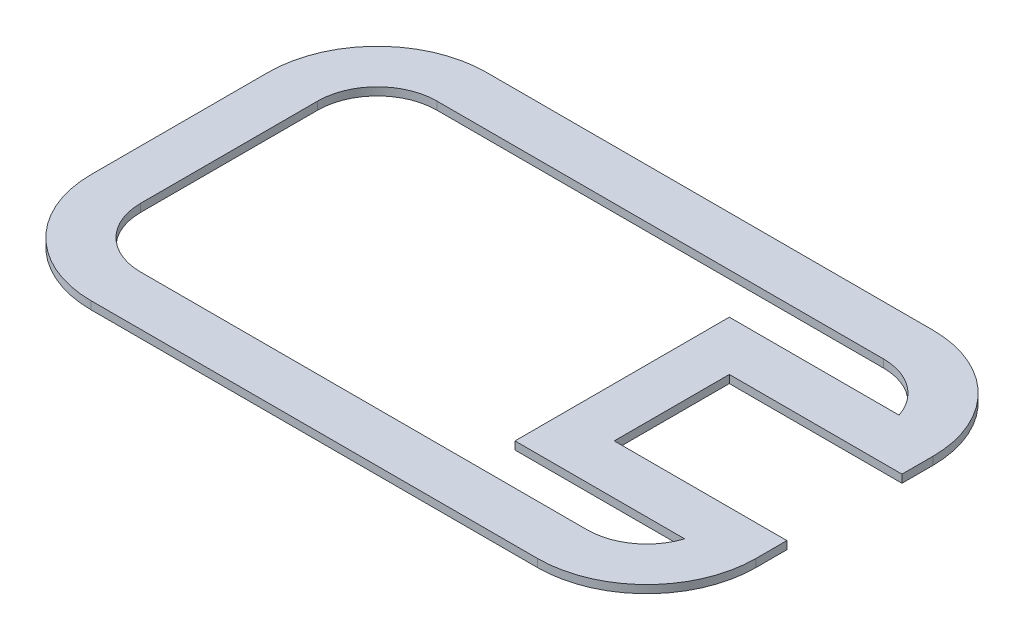
ISO-10303-21;
HEADER;
FILE_DESCRIPTION(('STEP AP214'),'2;1');
FILE_NAME('part.step','',(''),(''),'','','');
FILE_SCHEMA(('AUTOMOTIVE_DESIGN { 1 0 10303 214 1 1 1 1 }'));
ENDSEC;
DATA;
#1=APPLICATION_CONTEXT('core data for automotive mechanical design processes');
#2=APPLICATION_PROTOCOL_DEFINITION('international standard','automotive_design',2000,#1);
#3=PRODUCT_CONTEXT('',#1,'mechanical');
#4=PRODUCT('Part','Part','',(#3));
#5=PRODUCT_RELATED_PRODUCT_CATEGORY('part','',(#4));
#6=PRODUCT_DEFINITION_FORMATION('','',#4);
#7=PRODUCT_DEFINITION_CONTEXT('part definition',#1,'design');
#8=PRODUCT_DEFINITION('design','',#6,#7);
#9=PRODUCT_DEFINITION_SHAPE('','',#8);
#10=(LENGTH_UNIT() NAMED_UNIT(*) SI_UNIT(.MILLI.,.METRE.));
#11=(NAMED_UNIT(*) PLANE_ANGLE_UNIT() SI_UNIT($,.RADIAN.));
#12=(NAMED_UNIT(*) SI_UNIT($,.STERADIAN.) SOLID_ANGLE_UNIT());
#13=UNCERTAINTY_MEASURE_WITH_UNIT(LENGTH_MEASURE(1.E-05),#10,'distance_accuracy_value','');
#14=(GEOMETRIC_REPRESENTATION_CONTEXT(3) GLOBAL_UNCERTAINTY_ASSIGNED_CONTEXT((#13)) GLOBAL_UNIT_ASSIGNED_CONTEXT((#10,
#11,#12)) REPRESENTATION_CONTEXT('',''));
#15=CARTESIAN_POINT('',(0.,0.,0.));
#16=DIRECTION('',(0.,0.,1.));
#17=DIRECTION('',(1.,0.,0.));
#18=AXIS2_PLACEMENT_3D('',#15,#16,#17);
#19=CARTESIAN_POINT('',(-1.50147497416037,4.,115.909082592753));
#20=DIRECTION('',(0.,1.,0.));
#21=DIRECTION('',(0.,0.,1.));
#22=AXIS2_PLACEMENT_3D('',#19,#20,#21);
#23=PLANE('',#22);
#24=CARTESIAN_POINT('',(-1.50147497416037,4.,115.909082592753));
#25=DIRECTION('',(0.,1.,0.));
#26=DIRECTION('',(0.,0.,1.));
#27=AXIS2_PLACEMENT_3D('',#24,#25,#26);
#28=CIRCLE('',#27,55.);
#29=CARTESIAN_POINT('',(-56.5014749741604,4.,115.909082592752));
#30=VERTEX_POINT('',#29);
#31=CARTESIAN_POINT('',(-1.50147497415997,4.,170.909082592753));
#32=VERTEX_POINT('',#31);
#33=EDGE_CURVE('E261',#30,#32,#28,.T.);
#34=ORIENTED_EDGE('',*,*,#33,.T.);
#35=DIRECTION('',(1.,0.,0.));
#36=VECTOR('',#35,1.);
#37=CARTESIAN_POINT('',(-1.50147497415997,4.,170.909082592753));
#38=LINE('',#37,#36);
#39=CARTESIAN_POINT('',(223.528525025839,4.,170.909082592753));
#40=VERTEX_POINT('',#39);
#41=EDGE_CURVE('E264',#32,#40,#38,.T.);
#42=ORIENTED_EDGE('',*,*,#41,.T.);
#43=CARTESIAN_POINT('',(223.52852502584,4.,115.909082592753));
#44=DIRECTION('',(0.,1.,0.));
#45=DIRECTION('',(0.,0.,1.));
#46=AXIS2_PLACEMENT_3D('',#43,#44,#45);
#47=CIRCLE('',#46,55.);
#48=CARTESIAN_POINT('',(278.52852502584,4.,115.909082592752));
#49=VERTEX_POINT('',#48);
#50=EDGE_CURVE('E267',#40,#49,#47,.T.);
#51=ORIENTED_EDGE('',*,*,#50,.T.);
#52=DIRECTION('',(0.,0.,-1.));
#53=VECTOR('',#52,1.);
#54=CARTESIAN_POINT('',(278.52852502584,4.,100.279082592753));
#55=LINE('',#54,#53);
#56=CARTESIAN_POINT('',(278.52852502584,4.,100.279082592753));
#57=VERTEX_POINT('',#56);
#58=EDGE_CURVE('E269',#49,#57,#55,.T.);
#59=ORIENTED_EDGE('',*,*,#58,.T.);
#60=DIRECTION('',(-1.,0.,0.));
#61=VECTOR('',#60,1.);
#62=CARTESIAN_POINT('',(191.52852502584,4.,100.279082592753));
#63=LINE('',#62,#61);
#64=CARTESIAN_POINT('',(191.52852502584,4.,100.279082592753));
#65=VERTEX_POINT('',#64);
#66=EDGE_CURVE('E271',#57,#65,#63,.T.);
#67=ORIENTED_EDGE('',*,*,#66,.T.);
#68=DIRECTION('',(0.,0.,-1.));
#69=VECTOR('',#68,1.);
#70=CARTESIAN_POINT('',(191.52852502584,4.,42.2790825927528));
#71=LINE('',#70,#69);
#72=CARTESIAN_POINT('',(191.52852502584,4.,42.2790825927528));
#73=VERTEX_POINT('',#72);
#74=EDGE_CURVE('E273',#65,#73,#71,.T.);
#75=ORIENTED_EDGE('',*,*,#74,.T.);
#76=DIRECTION('',(1.,0.,0.));
#77=VECTOR('',#76,1.);
#78=CARTESIAN_POINT('',(191.52852502584,4.,42.2790825927528));
#79=LINE('',#78,#77);
#80=CARTESIAN_POINT('',(278.52852502584,4.,42.2790825927528));
#81=VERTEX_POINT('',#80);
#82=EDGE_CURVE('E275',#73,#81,#79,.T.);
#83=ORIENTED_EDGE('',*,*,#82,.T.);
#84=DIRECTION('',(0.,0.,-1.));
#85=VECTOR('',#84,1.);
#86=CARTESIAN_POINT('',(278.52852502584,4.,26.6490825927532));
#87=LINE('',#86,#85);
#88=CARTESIAN_POINT('',(278.52852502584,4.,26.6490825927532));
#89=VERTEX_POINT('',#88);
#90=EDGE_CURVE('E277',#81,#89,#87,.T.);
#91=ORIENTED_EDGE('',*,*,#90,.T.);
#92=CARTESIAN_POINT('',(223.52852502584,4.,26.6490825927529));
#93=DIRECTION('',(0.,1.,0.));
#94=DIRECTION('',(0.,0.,-1.));
#95=AXIS2_PLACEMENT_3D('',#92,#93,#94);
#96=CIRCLE('',#95,55.);
#97=CARTESIAN_POINT('',(223.528525025839,4.,-28.3509174072471));
#98=VERTEX_POINT('',#97);
#99=EDGE_CURVE('E279',#89,#98,#96,.T.);
#100=ORIENTED_EDGE('',*,*,#99,.T.);
#101=DIRECTION('',(-1.,0.,0.));
#102=VECTOR('',#101,1.);
#103=CARTESIAN_POINT('',(-1.50147497416,4.,-28.3509174072471));
#104=LINE('',#103,#102);
#105=CARTESIAN_POINT('',(-1.50147497416001,4.,-28.3509174072471));
#106=VERTEX_POINT('',#105);
#107=EDGE_CURVE('E281',#98,#106,#104,.T.);
#108=ORIENTED_EDGE('',*,*,#107,.T.);
#109=CARTESIAN_POINT('',(-1.50147497416038,4.,26.6490825927529));
#110=DIRECTION('',(0.,1.,0.));
#111=DIRECTION('',(0.,0.,1.));
#112=AXIS2_PLACEMENT_3D('',#109,#110,#111);
#113=CIRCLE('',#112,55.);
#114=CARTESIAN_POINT('',(-56.5014749741604,4.,26.6490825927532));
#115=VERTEX_POINT('',#114);
#116=EDGE_CURVE('E283',#106,#115,#113,.T.);
#117=ORIENTED_EDGE('',*,*,#116,.T.);
#118=DIRECTION('',(0.,0.,1.));
#119=VECTOR('',#118,1.);
#120=CARTESIAN_POINT('',(-56.5014749741604,4.,26.6490825927532));
#121=LINE('',#120,#119);
#122=EDGE_CURVE('E285',#115,#30,#121,.T.);
#123=ORIENTED_EDGE('',*,*,#122,.T.);
#124=EDGE_LOOP('',(#34,#42,#51,#59,#67,#75,#83,#91,#100,#108,#117,#123));
#125=FACE_BOUND('',#124,.T.);
#126=DIRECTION('',(0.,0.,-1.));
#127=VECTOR('',#126,1.);
#128=CARTESIAN_POINT('',(166.52852502584,4.,17.2790825927528));
#129=LINE('',#128,#127);
#130=CARTESIAN_POINT('',(166.52852502584,4.,125.279082592753));
#131=VERTEX_POINT('',#130);
#132=CARTESIAN_POINT('',(166.52852502584,4.,17.2790825927528));
#133=VERTEX_POINT('',#132);
#134=EDGE_CURVE('E190',#131,#133,#129,.T.);
#135=ORIENTED_EDGE('',*,*,#134,.F.);
#136=DIRECTION('',(-1.,0.,0.));
#137=VECTOR('',#136,1.);
#138=CARTESIAN_POINT('',(166.52852502584,4.,125.279082592753));
#139=LINE('',#138,#137);
#140=CARTESIAN_POINT('',(252.027702206944,4.,125.279082592753));
#141=VERTEX_POINT('',#140);
#142=EDGE_CURVE('E182',#141,#131,#139,.T.);
#143=ORIENTED_EDGE('',*,*,#142,.F.);
#144=CARTESIAN_POINT('',(223.52852502584,4.,115.909082592753));
#145=DIRECTION('',(0.,1.,0.));
#146=DIRECTION('',(0.,0.,1.));
#147=AXIS2_PLACEMENT_3D('',#144,#145,#146);
#148=CIRCLE('',#147,30.);
#149=CARTESIAN_POINT('',(223.52852502584,4.,145.909082592753));
#150=VERTEX_POINT('',#149);
#151=EDGE_CURVE('E219',#150,#141,#148,.T.);
#152=ORIENTED_EDGE('',*,*,#151,.F.);
#153=DIRECTION('',(1.,0.,0.));
#154=VECTOR('',#153,1.);
#155=CARTESIAN_POINT('',(-1.50147497415997,4.,145.909082592753));
#156=LINE('',#155,#154);
#157=CARTESIAN_POINT('',(-1.50147497415997,4.,145.909082592753));
#158=VERTEX_POINT('',#157);
#159=EDGE_CURVE('E217',#158,#150,#156,.T.);
#160=ORIENTED_EDGE('',*,*,#159,.F.);
#161=CARTESIAN_POINT('',(-1.50147497416037,4.,115.909082592753));
#162=DIRECTION('',(0.,1.,0.));
#163=DIRECTION('',(0.,0.,1.));
#164=AXIS2_PLACEMENT_3D('',#161,#162,#163);
#165=CIRCLE('',#164,30.);
#166=CARTESIAN_POINT('',(-31.5014749741604,4.,115.909082592753));
#167=VERTEX_POINT('',#166);
#168=EDGE_CURVE('E215',#167,#158,#165,.T.);
#169=ORIENTED_EDGE('',*,*,#168,.F.);
#170=DIRECTION('',(0.,0.,1.));
#171=VECTOR('',#170,1.);
#172=CARTESIAN_POINT('',(-31.5014749741604,4.,26.6490825927532));
#173=LINE('',#172,#171);
#174=CARTESIAN_POINT('',(-31.5014749741604,4.,26.6490825927532));
#175=VERTEX_POINT('',#174);
#176=EDGE_CURVE('E213',#175,#167,#173,.T.);
#177=ORIENTED_EDGE('',*,*,#176,.F.);
#178=CARTESIAN_POINT('',(-1.50147497416038,4.,26.6490825927529));
#179=DIRECTION('',(0.,1.,0.));
#180=DIRECTION('',(0.,0.,1.));
#181=AXIS2_PLACEMENT_3D('',#178,#179,#180);
#182=CIRCLE('',#181,30.);
#183=CARTESIAN_POINT('',(-1.50147497416018,4.,-3.35091740724714));
#184=VERTEX_POINT('',#183);
#185=EDGE_CURVE('E211',#184,#175,#182,.T.);
#186=ORIENTED_EDGE('',*,*,#185,.F.);
#187=DIRECTION('',(-1.,0.,0.));
#188=VECTOR('',#187,1.);
#189=CARTESIAN_POINT('',(-1.50147497416017,4.,-3.35091740724714));
#190=LINE('',#189,#188);
#191=CARTESIAN_POINT('',(223.528525025839,4.,-3.35091740724714));
#192=VERTEX_POINT('',#191);
#193=EDGE_CURVE('E209',#192,#184,#190,.T.);
#194=ORIENTED_EDGE('',*,*,#193,.F.);
#195=CARTESIAN_POINT('',(223.52852502584,4.,26.6490825927529));
#196=DIRECTION('',(0.,1.,0.));
#197=DIRECTION('',(0.,0.,-1.));
#198=AXIS2_PLACEMENT_3D('',#195,#196,#197);
#199=CIRCLE('',#198,30.);
#200=CARTESIAN_POINT('',(252.027702206944,4.,17.2790825927528));
#201=VERTEX_POINT('',#200);
#202=EDGE_CURVE('E205',#201,#192,#199,.T.);
#203=ORIENTED_EDGE('',*,*,#202,.F.);
#204=DIRECTION('',(1.,0.,0.));
#205=VECTOR('',#204,1.);
#206=CARTESIAN_POINT('',(166.52852502584,4.,17.2790825927528));
#207=LINE('',#206,#205);
#208=EDGE_CURVE('E203',#133,#201,#207,.T.);
#209=ORIENTED_EDGE('',*,*,#208,.F.);
#210=EDGE_LOOP('',(#135,#143,#152,#160,#169,#177,#186,#194,#203,#209));
#211=FACE_BOUND('',#210,.T.);
#212=ADVANCED_FACE('F33',(#125,#211),#23,.T.);
#213=CARTESIAN_POINT('',(-1.50147497416037,0.,115.909082592753));
#214=DIRECTION('',(0.,1.,0.));
#215=DIRECTION('',(0.,0.,1.));
#216=AXIS2_PLACEMENT_3D('',#213,#214,#215);
#217=PLANE('',#216);
#218=CARTESIAN_POINT('',(-1.50147497416037,0.,115.909082592753));
#219=DIRECTION('',(0.,1.,0.));
#220=DIRECTION('',(0.,0.,1.));
#221=AXIS2_PLACEMENT_3D('',#218,#219,#220);
#222=CIRCLE('',#221,55.);
#223=CARTESIAN_POINT('',(-56.5014749741604,0.,115.909082592752));
#224=VERTEX_POINT('',#223);
#225=CARTESIAN_POINT('',(-1.50147497415997,0.,170.909082592753));
#226=VERTEX_POINT('',#225);
#227=EDGE_CURVE('E198',#224,#226,#222,.T.);
#228=ORIENTED_EDGE('',*,*,#227,.F.);
#229=DIRECTION('',(0.,0.,1.));
#230=VECTOR('',#229,1.);
#231=CARTESIAN_POINT('',(-56.5014749741604,0.,26.6490825927532));
#232=LINE('',#231,#230);
#233=CARTESIAN_POINT('',(-56.5014749741604,0.,26.6490825927532));
#234=VERTEX_POINT('',#233);
#235=EDGE_CURVE('E265',#234,#224,#232,.T.);
#236=ORIENTED_EDGE('',*,*,#235,.F.);
#237=CARTESIAN_POINT('',(-1.50147497416038,0.,26.6490825927529));
#238=DIRECTION('',(0.,1.,0.));
#239=DIRECTION('',(0.,0.,1.));
#240=AXIS2_PLACEMENT_3D('',#237,#238,#239);
#241=CIRCLE('',#240,55.);
#242=CARTESIAN_POINT('',(-1.50147497416001,0.,-28.3509174072471));
#243=VERTEX_POINT('',#242);
#244=EDGE_CURVE('E308',#243,#234,#241,.T.);
#245=ORIENTED_EDGE('',*,*,#244,.F.);
#246=DIRECTION('',(-1.,0.,0.));
#247=VECTOR('',#246,1.);
#248=CARTESIAN_POINT('',(-1.50147497416,0.,-28.3509174072471));
#249=LINE('',#248,#247);
#250=CARTESIAN_POINT('',(223.528525025839,0.,-28.3509174072471));
#251=VERTEX_POINT('',#250);
#252=EDGE_CURVE('E306',#251,#243,#249,.T.);
#253=ORIENTED_EDGE('',*,*,#252,.F.);
#254=CARTESIAN_POINT('',(223.52852502584,0.,26.6490825927529));
#255=DIRECTION('',(0.,1.,0.));
#256=DIRECTION('',(0.,0.,-1.));
#257=AXIS2_PLACEMENT_3D('',#254,#255,#256);
#258=CIRCLE('',#257,55.);
#259=CARTESIAN_POINT('',(278.52852502584,0.,26.6490825927532));
#260=VERTEX_POINT('',#259);
#261=EDGE_CURVE('E304',#260,#251,#258,.T.);
#262=ORIENTED_EDGE('',*,*,#261,.F.);
#263=DIRECTION('',(0.,0.,-1.));
#264=VECTOR('',#263,1.);
#265=CARTESIAN_POINT('',(278.52852502584,0.,26.6490825927532));
#266=LINE('',#265,#264);
#267=CARTESIAN_POINT('',(278.52852502584,0.,42.2790825927528));
#268=VERTEX_POINT('',#267);
#269=EDGE_CURVE('E302',#268,#260,#266,.T.);
#270=ORIENTED_EDGE('',*,*,#269,.F.);
#271=DIRECTION('',(1.,0.,0.));
#272=VECTOR('',#271,1.);
#273=CARTESIAN_POINT('',(191.52852502584,0.,42.2790825927528));
#274=LINE('',#273,#272);
#275=CARTESIAN_POINT('',(191.52852502584,0.,42.2790825927528));
#276=VERTEX_POINT('',#275);
#277=EDGE_CURVE('E300',#276,#268,#274,.T.);
#278=ORIENTED_EDGE('',*,*,#277,.F.);
#279=DIRECTION('',(0.,0.,-1.));
#280=VECTOR('',#279,1.);
#281=CARTESIAN_POINT('',(191.52852502584,0.,42.2790825927528));
#282=LINE('',#281,#280);
#283=CARTESIAN_POINT('',(191.52852502584,0.,100.279082592753));
#284=VERTEX_POINT('',#283);
#285=EDGE_CURVE('E298',#284,#276,#282,.T.);
#286=ORIENTED_EDGE('',*,*,#285,.F.);
#287=DIRECTION('',(-1.,0.,0.));
#288=VECTOR('',#287,1.);
#289=CARTESIAN_POINT('',(191.52852502584,0.,100.279082592753));
#290=LINE('',#289,#288);
#291=CARTESIAN_POINT('',(278.52852502584,0.,100.279082592753));
#292=VERTEX_POINT('',#291);
#293=EDGE_CURVE('E296',#292,#284,#290,.T.);
#294=ORIENTED_EDGE('',*,*,#293,.F.);
#295=DIRECTION('',(0.,0.,-1.));
#296=VECTOR('',#295,1.);
#297=CARTESIAN_POINT('',(278.52852502584,0.,100.279082592753));
#298=LINE('',#297,#296);
#299=CARTESIAN_POINT('',(278.52852502584,0.,115.909082592752));
#300=VERTEX_POINT('',#299);
#301=EDGE_CURVE('E294',#300,#292,#298,.T.);
#302=ORIENTED_EDGE('',*,*,#301,.F.);
#303=CARTESIAN_POINT('',(223.52852502584,0.,115.909082592753));
#304=DIRECTION('',(0.,1.,0.));
#305=DIRECTION('',(0.,0.,1.));
#306=AXIS2_PLACEMENT_3D('',#303,#304,#305);
#307=CIRCLE('',#306,55.);
#308=CARTESIAN_POINT('',(223.528525025839,0.,170.909082592753));
#309=VERTEX_POINT('',#308);
#310=EDGE_CURVE('E292',#309,#300,#307,.T.);
#311=ORIENTED_EDGE('',*,*,#310,.F.);
#312=DIRECTION('',(1.,0.,0.));
#313=VECTOR('',#312,1.);
#314=CARTESIAN_POINT('',(-1.50147497415997,0.,170.909082592753));
#315=LINE('',#314,#313);
#316=EDGE_CURVE('E290',#226,#309,#315,.T.);
#317=ORIENTED_EDGE('',*,*,#316,.F.);
#318=EDGE_LOOP('',(#228,#236,#245,#253,#262,#270,#278,#286,#294,#302,#311,#317));
#319=FACE_BOUND('',#318,.T.);
#320=DIRECTION('',(-1.,0.,0.));
#321=VECTOR('',#320,1.);
#322=CARTESIAN_POINT('',(166.52852502584,0.,125.279082592753));
#323=LINE('',#322,#321);
#324=CARTESIAN_POINT('',(252.027702206944,0.,125.279082592753));
#325=VERTEX_POINT('',#324);
#326=CARTESIAN_POINT('',(166.52852502584,0.,125.279082592753));
#327=VERTEX_POINT('',#326);
#328=EDGE_CURVE('E56',#325,#327,#323,.T.);
#329=ORIENTED_EDGE('',*,*,#328,.T.);
#330=DIRECTION('',(0.,0.,-1.));
#331=VECTOR('',#330,1.);
#332=CARTESIAN_POINT('',(166.52852502584,0.,17.2790825927528));
#333=LINE('',#332,#331);
#334=CARTESIAN_POINT('',(166.52852502584,0.,17.2790825927528));
#335=VERTEX_POINT('',#334);
#336=EDGE_CURVE('E197',#327,#335,#333,.T.);
#337=ORIENTED_EDGE('',*,*,#336,.T.);
#338=DIRECTION('',(1.,0.,0.));
#339=VECTOR('',#338,1.);
#340=CARTESIAN_POINT('',(166.52852502584,0.,17.2790825927528));
#341=LINE('',#340,#339);
#342=CARTESIAN_POINT('',(252.027702206944,0.,17.2790825927528));
#343=VERTEX_POINT('',#342);
#344=EDGE_CURVE('E223',#335,#343,#341,.T.);
#345=ORIENTED_EDGE('',*,*,#344,.T.);
#346=CARTESIAN_POINT('',(223.52852502584,0.,26.6490825927529));
#347=DIRECTION('',(0.,1.,0.));
#348=DIRECTION('',(0.,0.,-1.));
#349=AXIS2_PLACEMENT_3D('',#346,#347,#348);
#350=CIRCLE('',#349,30.);
#351=CARTESIAN_POINT('',(223.528525025839,0.,-3.35091740724714));
#352=VERTEX_POINT('',#351);
#353=EDGE_CURVE('E226',#343,#352,#350,.T.);
#354=ORIENTED_EDGE('',*,*,#353,.T.);
#355=DIRECTION('',(-1.,0.,0.));
#356=VECTOR('',#355,1.);
#357=CARTESIAN_POINT('',(-1.50147497416017,0.,-3.35091740724714));
#358=LINE('',#357,#356);
#359=CARTESIAN_POINT('',(-1.50147497416018,0.,-3.35091740724714));
#360=VERTEX_POINT('',#359);
#361=EDGE_CURVE('E229',#352,#360,#358,.T.);
#362=ORIENTED_EDGE('',*,*,#361,.T.);
#363=CARTESIAN_POINT('',(-1.50147497416038,0.,26.6490825927529));
#364=DIRECTION('',(0.,1.,0.));
#365=DIRECTION('',(0.,0.,1.));
#366=AXIS2_PLACEMENT_3D('',#363,#364,#365);
#367=CIRCLE('',#366,30.);
#368=CARTESIAN_POINT('',(-31.5014749741604,0.,26.6490825927532));
#369=VERTEX_POINT('',#368);
#370=EDGE_CURVE('E232',#360,#369,#367,.T.);
#371=ORIENTED_EDGE('',*,*,#370,.T.);
#372=DIRECTION('',(0.,0.,1.));
#373=VECTOR('',#372,1.);
#374=CARTESIAN_POINT('',(-31.5014749741604,0.,26.6490825927532));
#375=LINE('',#374,#373);
#376=CARTESIAN_POINT('',(-31.5014749741604,0.,115.909082592753));
#377=VERTEX_POINT('',#376);
#378=EDGE_CURVE('E235',#369,#377,#375,.T.);
#379=ORIENTED_EDGE('',*,*,#378,.T.);
#380=CARTESIAN_POINT('',(-1.50147497416037,0.,115.909082592753));
#381=DIRECTION('',(0.,1.,0.));
#382=DIRECTION('',(0.,0.,1.));
#383=AXIS2_PLACEMENT_3D('',#380,#381,#382);
#384=CIRCLE('',#383,30.);
#385=CARTESIAN_POINT('',(-1.50147497415997,0.,145.909082592753));
#386=VERTEX_POINT('',#385);
#387=EDGE_CURVE('E238',#377,#386,#384,.T.);
#388=ORIENTED_EDGE('',*,*,#387,.T.);
#389=DIRECTION('',(1.,0.,0.));
#390=VECTOR('',#389,1.);
#391=CARTESIAN_POINT('',(-1.50147497415997,0.,145.909082592753));
#392=LINE('',#391,#390);
#393=CARTESIAN_POINT('',(223.528525025839,0.,145.909082592753));
#394=VERTEX_POINT('',#393);
#395=EDGE_CURVE('E241',#386,#394,#392,.T.);
#396=ORIENTED_EDGE('',*,*,#395,.T.);
#397=CARTESIAN_POINT('',(223.52852502584,0.,115.909082592753));
#398=DIRECTION('',(0.,1.,0.));
#399=DIRECTION('',(0.,0.,1.));
#400=AXIS2_PLACEMENT_3D('',#397,#398,#399);
#401=CIRCLE('',#400,30.);
#402=EDGE_CURVE('E191',#394,#325,#401,.T.);
#403=ORIENTED_EDGE('',*,*,#402,.T.);
#404=EDGE_LOOP('',(#329,#337,#345,#354,#362,#371,#379,#388,#396,#403));
#405=FACE_BOUND('',#404,.T.);
#406=ADVANCED_FACE('F350',(#319,#405),#217,.F.);
#407=CARTESIAN_POINT('',(-1.50147497416037,4.,115.909082592753));
#408=DIRECTION('',(0.,-1.,0.));
#409=DIRECTION('',(0.,0.,-1.));
#410=AXIS2_PLACEMENT_3D('',#407,#408,#409);
#411=CYLINDRICAL_SURFACE('',#410,55.);
#412=ORIENTED_EDGE('',*,*,#227,.T.);
#413=DIRECTION('',(0.,-1.,0.));
#414=VECTOR('',#413,1.);
#415=CARTESIAN_POINT('',(-1.50147497415997,4.,170.909082592753));
#416=LINE('',#415,#414);
#417=EDGE_CURVE('E11',#32,#226,#416,.T.);
#418=ORIENTED_EDGE('',*,*,#417,.F.);
#419=ORIENTED_EDGE('',*,*,#33,.F.);
#420=DIRECTION('',(0.,-1.,0.));
#421=VECTOR('',#420,1.);
#422=CARTESIAN_POINT('',(-56.5014749741604,4.,115.909082592752));
#423=LINE('',#422,#421);
#424=EDGE_CURVE('E287',#30,#224,#423,.T.);
#425=ORIENTED_EDGE('',*,*,#424,.T.);
#426=EDGE_LOOP('',(#412,#418,#419,#425));
#427=FACE_BOUND('',#426,.T.);
#428=ADVANCED_FACE('F35',(#427),#411,.T.);
#429=CARTESIAN_POINT('',(-1.50147497415997,4.,170.909082592753));
#430=DIRECTION('',(0.,0.,-1.));
#431=DIRECTION('',(-1.,0.,0.));
#432=AXIS2_PLACEMENT_3D('',#429,#430,#431);
#433=PLANE('',#432);
#434=ORIENTED_EDGE('',*,*,#316,.T.);
#435=DIRECTION('',(0.,-1.,0.));
#436=VECTOR('',#435,1.);
#437=CARTESIAN_POINT('',(223.528525025839,4.,170.909082592753));
#438=LINE('',#437,#436);
#439=EDGE_CURVE('E41',#40,#309,#438,.T.);
#440=ORIENTED_EDGE('',*,*,#439,.F.);
#441=ORIENTED_EDGE('',*,*,#41,.F.);
#442=ORIENTED_EDGE('',*,*,#417,.T.);
#443=EDGE_LOOP('',(#434,#440,#441,#442));
#444=FACE_BOUND('',#443,.T.);
#445=ADVANCED_FACE('F367',(#444),#433,.F.);
#446=CARTESIAN_POINT('',(223.52852502584,4.,115.909082592753));
#447=DIRECTION('',(0.,-1.,0.));
#448=DIRECTION('',(0.,0.,-1.));
#449=AXIS2_PLACEMENT_3D('',#446,#447,#448);
#450=CYLINDRICAL_SURFACE('',#449,55.);
#451=ORIENTED_EDGE('',*,*,#310,.T.);
#452=DIRECTION('',(0.,-1.,0.));
#453=VECTOR('',#452,1.);
#454=CARTESIAN_POINT('',(278.52852502584,4.,115.909082592752));
#455=LINE('',#454,#453);
#456=EDGE_CURVE('E337',#49,#300,#455,.T.);
#457=ORIENTED_EDGE('',*,*,#456,.F.);
#458=ORIENTED_EDGE('',*,*,#50,.F.);
#459=ORIENTED_EDGE('',*,*,#439,.T.);
#460=EDGE_LOOP('',(#451,#457,#458,#459));
#461=FACE_BOUND('',#460,.T.);
#462=ADVANCED_FACE('F344',(#461),#450,.T.);
#463=CARTESIAN_POINT('',(278.52852502584,4.,100.279082592753));
#464=DIRECTION('',(-1.,0.,0.));
#465=DIRECTION('',(0.,0.,1.));
#466=AXIS2_PLACEMENT_3D('',#463,#464,#465);
#467=PLANE('',#466);
#468=ORIENTED_EDGE('',*,*,#301,.T.);
#469=DIRECTION('',(0.,-1.,0.));
#470=VECTOR('',#469,1.);
#471=CARTESIAN_POINT('',(278.52852502584,4.,100.279082592753));
#472=LINE('',#471,#470);
#473=EDGE_CURVE('E334',#57,#292,#472,.T.);
#474=ORIENTED_EDGE('',*,*,#473,.F.);
#475=ORIENTED_EDGE('',*,*,#58,.F.);
#476=ORIENTED_EDGE('',*,*,#456,.T.);
#477=EDGE_LOOP('',(#468,#474,#475,#476));
#478=FACE_BOUND('',#477,.T.);
#479=ADVANCED_FACE('F356',(#478),#467,.F.);
#480=CARTESIAN_POINT('',(191.52852502584,4.,100.279082592753));
#481=DIRECTION('',(0.,0.,1.));
#482=DIRECTION('',(1.,0.,0.));
#483=AXIS2_PLACEMENT_3D('',#480,#481,#482);
#484=PLANE('',#483);
#485=ORIENTED_EDGE('',*,*,#293,.T.);
#486=DIRECTION('',(0.,-1.,0.));
#487=VECTOR('',#486,1.);
#488=CARTESIAN_POINT('',(191.52852502584,4.,100.279082592753));
#489=LINE('',#488,#487);
#490=EDGE_CURVE('E331',#65,#284,#489,.T.);
#491=ORIENTED_EDGE('',*,*,#490,.F.);
#492=ORIENTED_EDGE('',*,*,#66,.F.);
#493=ORIENTED_EDGE('',*,*,#473,.T.);
#494=EDGE_LOOP('',(#485,#491,#492,#493));
#495=FACE_BOUND('',#494,.T.);
#496=ADVANCED_FACE('F360',(#495),#484,.F.);
#497=CARTESIAN_POINT('',(191.52852502584,4.,42.2790825927528));
#498=DIRECTION('',(-1.,0.,0.));
#499=DIRECTION('',(0.,0.,1.));
#500=AXIS2_PLACEMENT_3D('',#497,#498,#499);
#501=PLANE('',#500);
#502=ORIENTED_EDGE('',*,*,#285,.T.);
#503=DIRECTION('',(0.,-1.,0.));
#504=VECTOR('',#503,1.);
#505=CARTESIAN_POINT('',(191.52852502584,4.,42.2790825927528));
#506=LINE('',#505,#504);
#507=EDGE_CURVE('E328',#73,#276,#506,.T.);
#508=ORIENTED_EDGE('',*,*,#507,.F.);
#509=ORIENTED_EDGE('',*,*,#74,.F.);
#510=ORIENTED_EDGE('',*,*,#490,.T.);
#511=EDGE_LOOP('',(#502,#508,#509,#510));
#512=FACE_BOUND('',#511,.T.);
#513=ADVANCED_FACE('F400',(#512),#501,.F.);
#514=CARTESIAN_POINT('',(191.52852502584,4.,42.2790825927528));
#515=DIRECTION('',(0.,0.,-1.));
#516=DIRECTION('',(-1.,0.,0.));
#517=AXIS2_PLACEMENT_3D('',#514,#515,#516);
#518=PLANE('',#517);
#519=ORIENTED_EDGE('',*,*,#277,.T.);
#520=DIRECTION('',(0.,-1.,0.));
#521=VECTOR('',#520,1.);
#522=CARTESIAN_POINT('',(278.52852502584,4.,42.2790825927528));
#523=LINE('',#522,#521);
#524=EDGE_CURVE('E325',#81,#268,#523,.T.);
#525=ORIENTED_EDGE('',*,*,#524,.F.);
#526=ORIENTED_EDGE('',*,*,#82,.F.);
#527=ORIENTED_EDGE('',*,*,#507,.T.);
#528=EDGE_LOOP('',(#519,#525,#526,#527));
#529=FACE_BOUND('',#528,.T.);
#530=ADVANCED_FACE('F398',(#529),#518,.F.);
#531=CARTESIAN_POINT('',(278.52852502584,4.,26.6490825927532));
#532=DIRECTION('',(-1.,0.,0.));
#533=DIRECTION('',(0.,0.,1.));
#534=AXIS2_PLACEMENT_3D('',#531,#532,#533);
#535=PLANE('',#534);
#536=ORIENTED_EDGE('',*,*,#269,.T.);
#537=DIRECTION('',(0.,-1.,0.));
#538=VECTOR('',#537,1.);
#539=CARTESIAN_POINT('',(278.52852502584,4.,26.6490825927532));
#540=LINE('',#539,#538);
#541=EDGE_CURVE('E322',#89,#260,#540,.T.);
#542=ORIENTED_EDGE('',*,*,#541,.F.);
#543=ORIENTED_EDGE('',*,*,#90,.F.);
#544=ORIENTED_EDGE('',*,*,#524,.T.);
#545=EDGE_LOOP('',(#536,#542,#543,#544));
#546=FACE_BOUND('',#545,.T.);
#547=ADVANCED_FACE('F394',(#546),#535,.F.);
#548=CARTESIAN_POINT('',(223.52852502584,4.,26.6490825927529));
#549=DIRECTION('',(0.,-1.,0.));
#550=DIRECTION('',(0.,0.,-1.));
#551=AXIS2_PLACEMENT_3D('',#548,#549,#550);
#552=CYLINDRICAL_SURFACE('',#551,55.);
#553=ORIENTED_EDGE('',*,*,#261,.T.);
#554=DIRECTION('',(0.,-1.,0.));
#555=VECTOR('',#554,1.);
#556=CARTESIAN_POINT('',(223.528525025839,4.,-28.3509174072471));
#557=LINE('',#556,#555);
#558=EDGE_CURVE('E319',#98,#251,#557,.T.);
#559=ORIENTED_EDGE('',*,*,#558,.F.);
#560=ORIENTED_EDGE('',*,*,#99,.F.);
#561=ORIENTED_EDGE('',*,*,#541,.T.);
#562=EDGE_LOOP('',(#553,#559,#560,#561));
#563=FACE_BOUND('',#562,.T.);
#564=ADVANCED_FACE('F389',(#563),#552,.T.);
#565=CARTESIAN_POINT('',(-1.50147497416,4.,-28.3509174072471));
#566=DIRECTION('',(0.,0.,1.));
#567=DIRECTION('',(1.,0.,0.));
#568=AXIS2_PLACEMENT_3D('',#565,#566,#567);
#569=PLANE('',#568);
#570=ORIENTED_EDGE('',*,*,#252,.T.);
#571=DIRECTION('',(0.,-1.,0.));
#572=VECTOR('',#571,1.);
#573=CARTESIAN_POINT('',(-1.50147497416001,4.,-28.3509174072471));
#574=LINE('',#573,#572);
#575=EDGE_CURVE('E316',#106,#243,#574,.T.);
#576=ORIENTED_EDGE('',*,*,#575,.F.);
#577=ORIENTED_EDGE('',*,*,#107,.F.);
#578=ORIENTED_EDGE('',*,*,#558,.T.);
#579=EDGE_LOOP('',(#570,#576,#577,#578));
#580=FACE_BOUND('',#579,.T.);
#581=ADVANCED_FACE('F383',(#580),#569,.F.);
#582=CARTESIAN_POINT('',(-1.50147497416038,4.,26.6490825927529));
#583=DIRECTION('',(0.,-1.,0.));
#584=DIRECTION('',(0.,0.,-1.));
#585=AXIS2_PLACEMENT_3D('',#582,#583,#584);
#586=CYLINDRICAL_SURFACE('',#585,55.);
#587=ORIENTED_EDGE('',*,*,#244,.T.);
#588=DIRECTION('',(0.,-1.,0.));
#589=VECTOR('',#588,1.);
#590=CARTESIAN_POINT('',(-56.5014749741604,4.,26.6490825927532));
#591=LINE('',#590,#589);
#592=EDGE_CURVE('E313',#115,#234,#591,.T.);
#593=ORIENTED_EDGE('',*,*,#592,.F.);
#594=ORIENTED_EDGE('',*,*,#116,.F.);
#595=ORIENTED_EDGE('',*,*,#575,.T.);
#596=EDGE_LOOP('',(#587,#593,#594,#595));
#597=FACE_BOUND('',#596,.T.);
#598=ADVANCED_FACE('F379',(#597),#586,.T.);
#599=CARTESIAN_POINT('',(-56.5014749741604,4.,26.6490825927532));
#600=DIRECTION('',(1.,0.,0.));
#601=DIRECTION('',(0.,0.,-1.));
#602=AXIS2_PLACEMENT_3D('',#599,#600,#601);
#603=PLANE('',#602);
#604=ORIENTED_EDGE('',*,*,#235,.T.);
#605=ORIENTED_EDGE('',*,*,#424,.F.);
#606=ORIENTED_EDGE('',*,*,#122,.F.);
#607=ORIENTED_EDGE('',*,*,#592,.T.);
#608=EDGE_LOOP('',(#604,#605,#606,#607));
#609=FACE_BOUND('',#608,.T.);
#610=ADVANCED_FACE('F374',(#609),#603,.F.);
#611=CARTESIAN_POINT('',(166.52852502584,4.,125.279082592753));
#612=DIRECTION('',(0.,0.,1.));
#613=DIRECTION('',(1.,0.,0.));
#614=AXIS2_PLACEMENT_3D('',#611,#612,#613);
#615=PLANE('',#614);
#616=ORIENTED_EDGE('',*,*,#328,.F.);
#617=DIRECTION('',(0.,-1.,0.));
#618=VECTOR('',#617,1.);
#619=CARTESIAN_POINT('',(252.027702206944,4.,125.279082592753));
#620=LINE('',#619,#618);
#621=EDGE_CURVE('E186',#141,#325,#620,.T.);
#622=ORIENTED_EDGE('',*,*,#621,.F.);
#623=ORIENTED_EDGE('',*,*,#142,.T.);
#624=DIRECTION('',(0.,-1.,0.));
#625=VECTOR('',#624,1.);
#626=CARTESIAN_POINT('',(166.52852502584,4.,125.279082592753));
#627=LINE('',#626,#625);
#628=EDGE_CURVE('E185',#131,#327,#627,.T.);
#629=ORIENTED_EDGE('',*,*,#628,.T.);
#630=EDGE_LOOP('',(#616,#622,#623,#629));
#631=FACE_BOUND('',#630,.T.);
#632=ADVANCED_FACE('F184',(#631),#615,.T.);
#633=CARTESIAN_POINT('',(166.52852502584,4.,17.2790825927528));
#634=DIRECTION('',(-1.,0.,0.));
#635=DIRECTION('',(0.,0.,1.));
#636=AXIS2_PLACEMENT_3D('',#633,#634,#635);
#637=PLANE('',#636);
#638=ORIENTED_EDGE('',*,*,#336,.F.);
#639=ORIENTED_EDGE('',*,*,#628,.F.);
#640=ORIENTED_EDGE('',*,*,#134,.T.);
#641=DIRECTION('',(0.,-1.,0.));
#642=VECTOR('',#641,1.);
#643=CARTESIAN_POINT('',(166.52852502584,4.,17.2790825927528));
#644=LINE('',#643,#642);
#645=EDGE_CURVE('E199',#133,#335,#644,.T.);
#646=ORIENTED_EDGE('',*,*,#645,.T.);
#647=EDGE_LOOP('',(#638,#639,#640,#646));
#648=FACE_BOUND('',#647,.T.);
#649=ADVANCED_FACE('F194',(#648),#637,.T.);
#650=CARTESIAN_POINT('',(166.52852502584,4.,17.2790825927528));
#651=DIRECTION('',(0.,0.,-1.));
#652=DIRECTION('',(-1.,0.,0.));
#653=AXIS2_PLACEMENT_3D('',#650,#651,#652);
#654=PLANE('',#653);
#655=ORIENTED_EDGE('',*,*,#344,.F.);
#656=ORIENTED_EDGE('',*,*,#645,.F.);
#657=ORIENTED_EDGE('',*,*,#208,.T.);
#658=DIRECTION('',(0.,-1.,0.));
#659=VECTOR('',#658,1.);
#660=CARTESIAN_POINT('',(252.027702206944,4.,17.2790825927528));
#661=LINE('',#660,#659);
#662=EDGE_CURVE('E258',#201,#343,#661,.T.);
#663=ORIENTED_EDGE('',*,*,#662,.T.);
#664=EDGE_LOOP('',(#655,#656,#657,#663));
#665=FACE_BOUND('',#664,.T.);
#666=ADVANCED_FACE('F458',(#665),#654,.T.);
#667=CARTESIAN_POINT('',(223.52852502584,4.,26.6490825927529));
#668=DIRECTION('',(0.,-1.,0.));
#669=DIRECTION('',(0.,0.,-1.));
#670=AXIS2_PLACEMENT_3D('',#667,#668,#669);
#671=CYLINDRICAL_SURFACE('',#670,30.);
#672=ORIENTED_EDGE('',*,*,#353,.F.);
#673=ORIENTED_EDGE('',*,*,#662,.F.);
#674=ORIENTED_EDGE('',*,*,#202,.T.);
#675=DIRECTION('',(0.,-1.,0.));
#676=VECTOR('',#675,1.);
#677=CARTESIAN_POINT('',(223.528525025839,4.,-3.35091740724714));
#678=LINE('',#677,#676);
#679=EDGE_CURVE('E256',#192,#352,#678,.T.);
#680=ORIENTED_EDGE('',*,*,#679,.T.);
#681=EDGE_LOOP('',(#672,#673,#674,#680));
#682=FACE_BOUND('',#681,.T.);
#683=ADVANCED_FACE('F464',(#682),#671,.F.);
#684=CARTESIAN_POINT('',(-1.50147497416017,4.,-3.35091740724714));
#685=DIRECTION('',(0.,0.,1.));
#686=DIRECTION('',(1.,0.,0.));
#687=AXIS2_PLACEMENT_3D('',#684,#685,#686);
#688=PLANE('',#687);
#689=ORIENTED_EDGE('',*,*,#361,.F.);
#690=ORIENTED_EDGE('',*,*,#679,.F.);
#691=ORIENTED_EDGE('',*,*,#193,.T.);
#692=DIRECTION('',(0.,-1.,0.));
#693=VECTOR('',#692,1.);
#694=CARTESIAN_POINT('',(-1.50147497416018,4.,-3.35091740724714));
#695=LINE('',#694,#693);
#696=EDGE_CURVE('E254',#184,#360,#695,.T.);
#697=ORIENTED_EDGE('',*,*,#696,.T.);
#698=EDGE_LOOP('',(#689,#690,#691,#697));
#699=FACE_BOUND('',#698,.T.);
#700=ADVANCED_FACE('F472',(#699),#688,.T.);
#701=CARTESIAN_POINT('',(-1.50147497416038,4.,26.6490825927529));
#702=DIRECTION('',(0.,-1.,0.));
#703=DIRECTION('',(0.,0.,-1.));
#704=AXIS2_PLACEMENT_3D('',#701,#702,#703);
#705=CYLINDRICAL_SURFACE('',#704,30.);
#706=ORIENTED_EDGE('',*,*,#370,.F.);
#707=ORIENTED_EDGE('',*,*,#696,.F.);
#708=ORIENTED_EDGE('',*,*,#185,.T.);
#709=DIRECTION('',(0.,-1.,0.));
#710=VECTOR('',#709,1.);
#711=CARTESIAN_POINT('',(-31.5014749741604,4.,26.6490825927532));
#712=LINE('',#711,#710);
#713=EDGE_CURVE('E252',#175,#369,#712,.T.);
#714=ORIENTED_EDGE('',*,*,#713,.T.);
#715=EDGE_LOOP('',(#706,#707,#708,#714));
#716=FACE_BOUND('',#715,.T.);
#717=ADVANCED_FACE('F480',(#716),#705,.F.);
#718=CARTESIAN_POINT('',(-31.5014749741604,4.,26.6490825927532));
#719=DIRECTION('',(1.,0.,0.));
#720=DIRECTION('',(0.,0.,-1.));
#721=AXIS2_PLACEMENT_3D('',#718,#719,#720);
#722=PLANE('',#721);
#723=ORIENTED_EDGE('',*,*,#378,.F.);
#724=ORIENTED_EDGE('',*,*,#713,.F.);
#725=ORIENTED_EDGE('',*,*,#176,.T.);
#726=DIRECTION('',(0.,-1.,0.));
#727=VECTOR('',#726,1.);
#728=CARTESIAN_POINT('',(-31.5014749741604,4.,115.909082592753));
#729=LINE('',#728,#727);
#730=EDGE_CURVE('E250',#167,#377,#729,.T.);
#731=ORIENTED_EDGE('',*,*,#730,.T.);
#732=EDGE_LOOP('',(#723,#724,#725,#731));
#733=FACE_BOUND('',#732,.T.);
#734=ADVANCED_FACE('F488',(#733),#722,.T.);
#735=CARTESIAN_POINT('',(-1.50147497416037,4.,115.909082592753));
#736=DIRECTION('',(0.,-1.,0.));
#737=DIRECTION('',(0.,0.,-1.));
#738=AXIS2_PLACEMENT_3D('',#735,#736,#737);
#739=CYLINDRICAL_SURFACE('',#738,30.);
#740=ORIENTED_EDGE('',*,*,#387,.F.);
#741=ORIENTED_EDGE('',*,*,#730,.F.);
#742=ORIENTED_EDGE('',*,*,#168,.T.);
#743=DIRECTION('',(0.,-1.,0.));
#744=VECTOR('',#743,1.);
#745=CARTESIAN_POINT('',(-1.50147497415997,4.,145.909082592753));
#746=LINE('',#745,#744);
#747=EDGE_CURVE('E248',#158,#386,#746,.T.);
#748=ORIENTED_EDGE('',*,*,#747,.T.);
#749=EDGE_LOOP('',(#740,#741,#742,#748));
#750=FACE_BOUND('',#749,.T.);
#751=ADVANCED_FACE('F496',(#750),#739,.F.);
#752=CARTESIAN_POINT('',(-1.50147497415997,4.,145.909082592753));
#753=DIRECTION('',(0.,0.,-1.));
#754=DIRECTION('',(-1.,0.,0.));
#755=AXIS2_PLACEMENT_3D('',#752,#753,#754);
#756=PLANE('',#755);
#757=ORIENTED_EDGE('',*,*,#395,.F.);
#758=ORIENTED_EDGE('',*,*,#747,.F.);
#759=ORIENTED_EDGE('',*,*,#159,.T.);
#760=DIRECTION('',(0.,-1.,0.));
#761=VECTOR('',#760,1.);
#762=CARTESIAN_POINT('',(223.528525025839,4.,145.909082592753));
#763=LINE('',#762,#761);
#764=EDGE_CURVE('E48',#150,#394,#763,.T.);
#765=ORIENTED_EDGE('',*,*,#764,.T.);
#766=EDGE_LOOP('',(#757,#758,#759,#765));
#767=FACE_BOUND('',#766,.T.);
#768=ADVANCED_FACE('F504',(#767),#756,.T.);
#769=CARTESIAN_POINT('',(223.52852502584,4.,115.909082592753));
#770=DIRECTION('',(0.,-1.,0.));
#771=DIRECTION('',(0.,0.,-1.));
#772=AXIS2_PLACEMENT_3D('',#769,#770,#771);
#773=CYLINDRICAL_SURFACE('',#772,30.);
#774=ORIENTED_EDGE('',*,*,#402,.F.);
#775=ORIENTED_EDGE('',*,*,#764,.F.);
#776=ORIENTED_EDGE('',*,*,#151,.T.);
#777=ORIENTED_EDGE('',*,*,#621,.T.);
#778=EDGE_LOOP('',(#774,#775,#776,#777));
#779=FACE_BOUND('',#778,.T.);
#780=ADVANCED_FACE('F512',(#779),#773,.F.);
#781=CLOSED_SHELL('',(#212,#406,#428,#445,#462,#479,#496,#513,#530,#547,#564,#581,#598,#610,
#632,#649,#666,#683,#700,#717,#734,#751,#768,#780));
#782=MANIFOLD_SOLID_BREP('B2',#781);
#783=ADVANCED_BREP_SHAPE_REPRESENTATION('',(#18,#782),#14);
#784=SHAPE_DEFINITION_REPRESENTATION(#9,#783);
ENDSEC;
END-ISO-10303-21;
